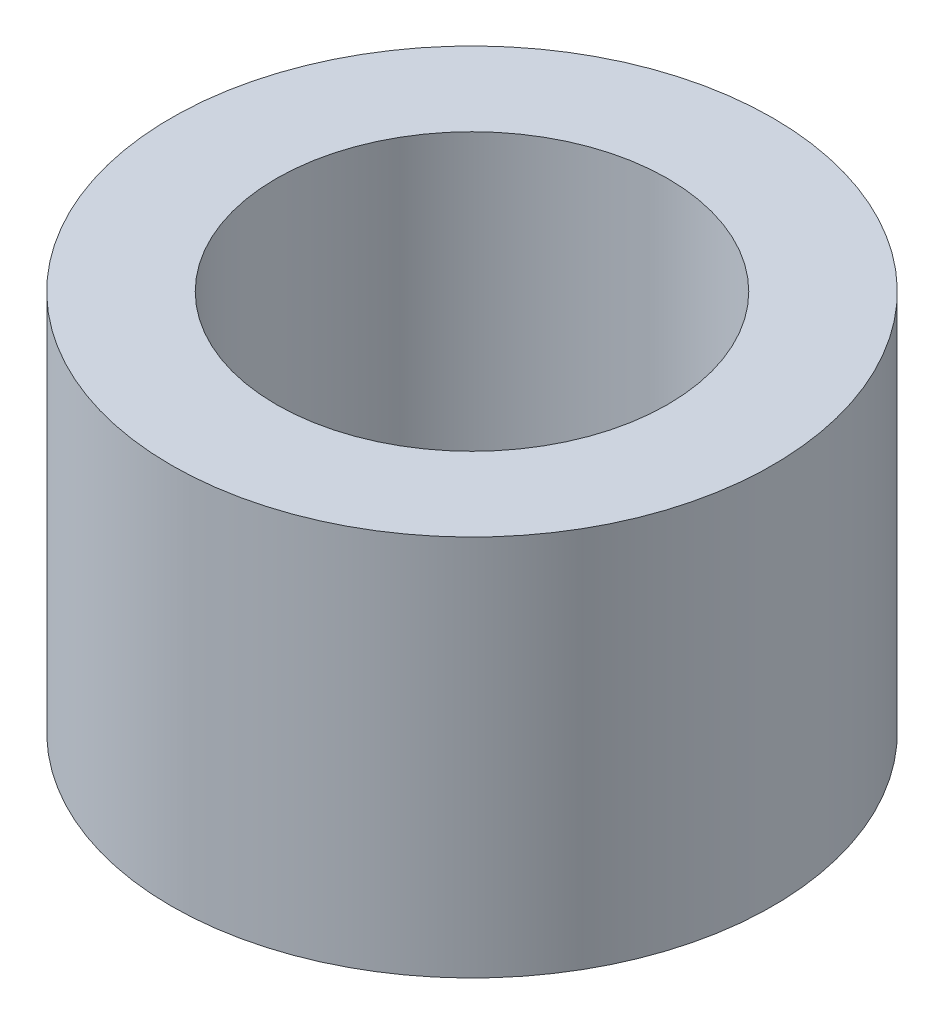
ISO-10303-21;
HEADER;
FILE_DESCRIPTION(('STEP AP214'),'2;1');
FILE_NAME('part.step','',(''),(''),'','','');
FILE_SCHEMA(('AUTOMOTIVE_DESIGN { 1 0 10303 214 1 1 1 1 }'));
ENDSEC;
DATA;
#1=APPLICATION_CONTEXT('core data for automotive mechanical design processes');
#2=APPLICATION_PROTOCOL_DEFINITION('international standard','automotive_design',2000,#1);
#3=PRODUCT_CONTEXT('',#1,'mechanical');
#4=PRODUCT('Part','Part','',(#3));
#5=PRODUCT_RELATED_PRODUCT_CATEGORY('part','',(#4));
#6=PRODUCT_DEFINITION_FORMATION('','',#4);
#7=PRODUCT_DEFINITION_CONTEXT('part definition',#1,'design');
#8=PRODUCT_DEFINITION('design','',#6,#7);
#9=PRODUCT_DEFINITION_SHAPE('','',#8);
#10=(LENGTH_UNIT() NAMED_UNIT(*) SI_UNIT(.MILLI.,.METRE.));
#11=(NAMED_UNIT(*) PLANE_ANGLE_UNIT() SI_UNIT($,.RADIAN.));
#12=(NAMED_UNIT(*) SI_UNIT($,.STERADIAN.) SOLID_ANGLE_UNIT());
#13=UNCERTAINTY_MEASURE_WITH_UNIT(LENGTH_MEASURE(1.E-05),#10,'distance_accuracy_value','');
#14=(GEOMETRIC_REPRESENTATION_CONTEXT(3) GLOBAL_UNCERTAINTY_ASSIGNED_CONTEXT((#13)) GLOBAL_UNIT_ASSIGNED_CONTEXT((#10,
#11,#12)) REPRESENTATION_CONTEXT('',''));
#15=CARTESIAN_POINT('',(0.,0.,0.));
#16=DIRECTION('',(0.,0.,1.));
#17=DIRECTION('',(1.,0.,0.));
#18=AXIS2_PLACEMENT_3D('',#15,#16,#17);
#19=CARTESIAN_POINT('',(0.,4.,0.));
#20=DIRECTION('',(0.,-1.,0.));
#21=DIRECTION('',(0.,0.,-1.));
#22=AXIS2_PLACEMENT_3D('',#19,#20,#21);
#23=CYLINDRICAL_SURFACE('',#22,2.05);
#24=CARTESIAN_POINT('',(0.,4.,0.));
#25=DIRECTION('',(0.,1.,0.));
#26=DIRECTION('',(0.,0.,1.));
#27=AXIS2_PLACEMENT_3D('',#24,#25,#26);
#28=CIRCLE('',#27,2.05);
#29=CARTESIAN_POINT('',(0.,4.,2.05));
#30=VERTEX_POINT('',#29);
#31=EDGE_CURVE('E40',#30,#30,#28,.T.);
#32=ORIENTED_EDGE('',*,*,#31,.T.);
#33=EDGE_LOOP('',(#32));
#34=FACE_BOUND('',#33,.T.);
#35=CARTESIAN_POINT('',(0.,0.,0.));
#36=DIRECTION('',(0.,1.,0.));
#37=DIRECTION('',(0.,0.,1.));
#38=AXIS2_PLACEMENT_3D('',#35,#36,#37);
#39=CIRCLE('',#38,2.05);
#40=CARTESIAN_POINT('',(0.,0.,2.05));
#41=VERTEX_POINT('',#40);
#42=EDGE_CURVE('E46',#41,#41,#39,.T.);
#43=ORIENTED_EDGE('',*,*,#42,.F.);
#44=EDGE_LOOP('',(#43));
#45=FACE_BOUND('',#44,.T.);
#46=ADVANCED_FACE('F33',(#34,#45),#23,.F.);
#47=CARTESIAN_POINT('',(0.,4.,0.));
#48=DIRECTION('',(0.,-1.,0.));
#49=DIRECTION('',(0.,0.,-1.));
#50=AXIS2_PLACEMENT_3D('',#47,#48,#49);
#51=CYLINDRICAL_SURFACE('',#50,3.15);
#52=CARTESIAN_POINT('',(0.,4.,0.));
#53=DIRECTION('',(0.,1.,0.));
#54=DIRECTION('',(0.,0.,1.));
#55=AXIS2_PLACEMENT_3D('',#52,#53,#54);
#56=CIRCLE('',#55,3.15);
#57=CARTESIAN_POINT('',(0.,4.,3.15));
#58=VERTEX_POINT('',#57);
#59=EDGE_CURVE('E10',#58,#58,#56,.T.);
#60=ORIENTED_EDGE('',*,*,#59,.F.);
#61=EDGE_LOOP('',(#60));
#62=FACE_BOUND('',#61,.T.);
#63=CARTESIAN_POINT('',(0.,0.,0.));
#64=DIRECTION('',(0.,1.,0.));
#65=DIRECTION('',(0.,0.,1.));
#66=AXIS2_PLACEMENT_3D('',#63,#64,#65);
#67=CIRCLE('',#66,3.15);
#68=CARTESIAN_POINT('',(0.,0.,3.15));
#69=VERTEX_POINT('',#68);
#70=EDGE_CURVE('E36',#69,#69,#67,.T.);
#71=ORIENTED_EDGE('',*,*,#70,.T.);
#72=EDGE_LOOP('',(#71));
#73=FACE_BOUND('',#72,.T.);
#74=ADVANCED_FACE('F53',(#62,#73),#51,.T.);
#75=CARTESIAN_POINT('',(0.,4.,0.));
#76=DIRECTION('',(0.,1.,0.));
#77=DIRECTION('',(0.,0.,1.));
#78=AXIS2_PLACEMENT_3D('',#75,#76,#77);
#79=PLANE('',#78);
#80=ORIENTED_EDGE('',*,*,#31,.F.);
#81=EDGE_LOOP('',(#80));
#82=FACE_BOUND('',#81,.T.);
#83=ORIENTED_EDGE('',*,*,#59,.T.);
#84=EDGE_LOOP('',(#83));
#85=FACE_BOUND('',#84,.T.);
#86=ADVANCED_FACE('F57',(#82,#85),#79,.T.);
#87=CARTESIAN_POINT('',(0.,0.,0.));
#88=DIRECTION('',(0.,1.,0.));
#89=DIRECTION('',(0.,0.,1.));
#90=AXIS2_PLACEMENT_3D('',#87,#88,#89);
#91=PLANE('',#90);
#92=ORIENTED_EDGE('',*,*,#42,.T.);
#93=EDGE_LOOP('',(#92));
#94=FACE_BOUND('',#93,.T.);
#95=ORIENTED_EDGE('',*,*,#70,.F.);
#96=EDGE_LOOP('',(#95));
#97=FACE_BOUND('',#96,.T.);
#98=ADVANCED_FACE('F55',(#94,#97),#91,.F.);
#99=CLOSED_SHELL('',(#46,#74,#86,#98));
#100=MANIFOLD_SOLID_BREP('B2',#99);
#101=ADVANCED_BREP_SHAPE_REPRESENTATION('',(#18,#100),#14);
#102=SHAPE_DEFINITION_REPRESENTATION(#9,#101);
ENDSEC;
END-ISO-10303-21;
